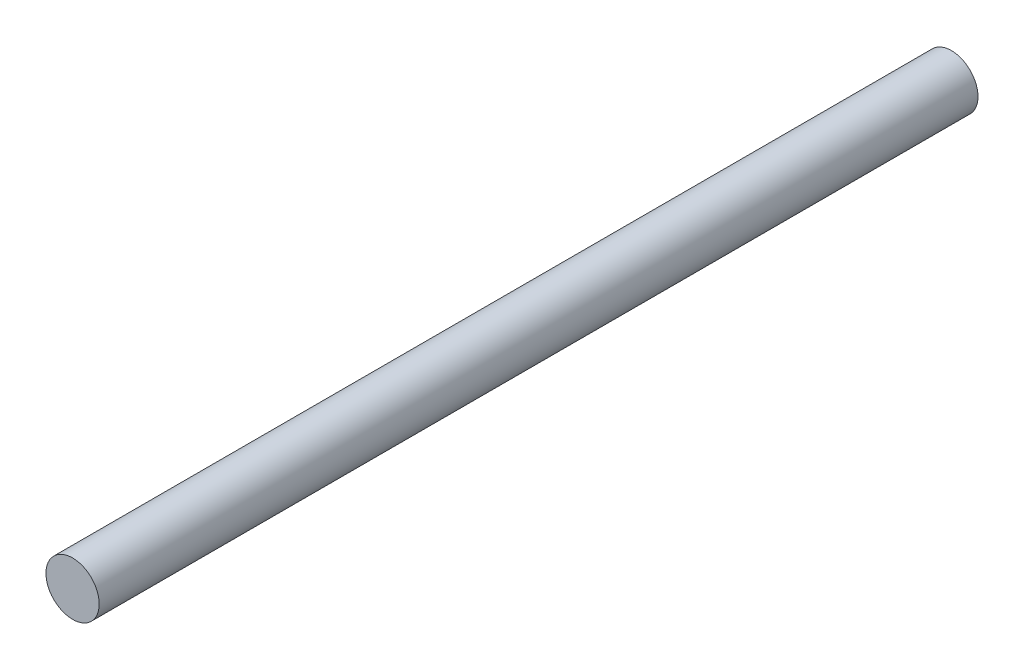
ISO-10303-21;
HEADER;
FILE_DESCRIPTION(('STEP AP214'),'2;1');
FILE_NAME('part.step','',(''),(''),'','','');
FILE_SCHEMA(('AUTOMOTIVE_DESIGN { 1 0 10303 214 1 1 1 1 }'));
ENDSEC;
DATA;
#1=APPLICATION_CONTEXT('core data for automotive mechanical design processes');
#2=APPLICATION_PROTOCOL_DEFINITION('international standard','automotive_design',2000,#1);
#3=PRODUCT_CONTEXT('',#1,'mechanical');
#4=PRODUCT('Part','Part','',(#3));
#5=PRODUCT_RELATED_PRODUCT_CATEGORY('part','',(#4));
#6=PRODUCT_DEFINITION_FORMATION('','',#4);
#7=PRODUCT_DEFINITION_CONTEXT('part definition',#1,'design');
#8=PRODUCT_DEFINITION('design','',#6,#7);
#9=PRODUCT_DEFINITION_SHAPE('','',#8);
#10=(LENGTH_UNIT() NAMED_UNIT(*) SI_UNIT(.MILLI.,.METRE.));
#11=(NAMED_UNIT(*) PLANE_ANGLE_UNIT() SI_UNIT($,.RADIAN.));
#12=(NAMED_UNIT(*) SI_UNIT($,.STERADIAN.) SOLID_ANGLE_UNIT());
#13=UNCERTAINTY_MEASURE_WITH_UNIT(LENGTH_MEASURE(1.E-05),#10,'distance_accuracy_value','');
#14=(GEOMETRIC_REPRESENTATION_CONTEXT(3) GLOBAL_UNCERTAINTY_ASSIGNED_CONTEXT((#13)) GLOBAL_UNIT_ASSIGNED_CONTEXT((#10,
#11,#12)) REPRESENTATION_CONTEXT('',''));
#15=CARTESIAN_POINT('',(0.,0.,0.));
#16=DIRECTION('',(0.,0.,1.));
#17=DIRECTION('',(1.,0.,0.));
#18=AXIS2_PLACEMENT_3D('',#15,#16,#17);
#19=CARTESIAN_POINT('',(0.,0.,33.));
#20=DIRECTION('',(0.,0.,-1.));
#21=DIRECTION('',(-1.,0.,0.));
#22=AXIS2_PLACEMENT_3D('',#19,#20,#21);
#23=CYLINDRICAL_SURFACE('',#22,2.);
#24=CARTESIAN_POINT('',(0.,0.,33.));
#25=DIRECTION('',(0.,0.,1.));
#26=DIRECTION('',(1.,0.,0.));
#27=AXIS2_PLACEMENT_3D('',#24,#25,#26);
#28=CIRCLE('',#27,2.);
#29=CARTESIAN_POINT('',(2.,0.,33.));
#30=VERTEX_POINT('',#29);
#31=EDGE_CURVE('E10',#30,#30,#28,.T.);
#32=ORIENTED_EDGE('',*,*,#31,.F.);
#33=EDGE_LOOP('',(#32));
#34=FACE_BOUND('',#33,.T.);
#35=CARTESIAN_POINT('',(0.,0.,-33.));
#36=DIRECTION('',(0.,0.,1.));
#37=DIRECTION('',(1.,0.,0.));
#38=AXIS2_PLACEMENT_3D('',#35,#36,#37);
#39=CIRCLE('',#38,2.);
#40=CARTESIAN_POINT('',(2.,0.,-33.));
#41=VERTEX_POINT('',#40);
#42=EDGE_CURVE('E41',#41,#41,#39,.T.);
#43=ORIENTED_EDGE('',*,*,#42,.T.);
#44=EDGE_LOOP('',(#43));
#45=FACE_BOUND('',#44,.T.);
#46=ADVANCED_FACE('F38',(#34,#45),#23,.T.);
#47=CARTESIAN_POINT('',(0.,0.,33.));
#48=DIRECTION('',(0.,0.,1.));
#49=DIRECTION('',(1.,0.,0.));
#50=AXIS2_PLACEMENT_3D('',#47,#48,#49);
#51=PLANE('',#50);
#52=ORIENTED_EDGE('',*,*,#31,.T.);
#53=EDGE_LOOP('',(#52));
#54=FACE_BOUND('',#53,.T.);
#55=ADVANCED_FACE('F53',(#54),#51,.T.);
#56=CARTESIAN_POINT('',(0.,0.,-33.));
#57=DIRECTION('',(0.,0.,1.));
#58=DIRECTION('',(1.,0.,0.));
#59=AXIS2_PLACEMENT_3D('',#56,#57,#58);
#60=PLANE('',#59);
#61=ORIENTED_EDGE('',*,*,#42,.F.);
#62=EDGE_LOOP('',(#61));
#63=FACE_BOUND('',#62,.T.);
#64=ADVANCED_FACE('F51',(#63),#60,.F.);
#65=CLOSED_SHELL('',(#46,#55,#64));
#66=MANIFOLD_SOLID_BREP('B2',#65);
#67=ADVANCED_BREP_SHAPE_REPRESENTATION('',(#18,#66),#14);
#68=SHAPE_DEFINITION_REPRESENTATION(#9,#67);
ENDSEC;
END-ISO-10303-21;
